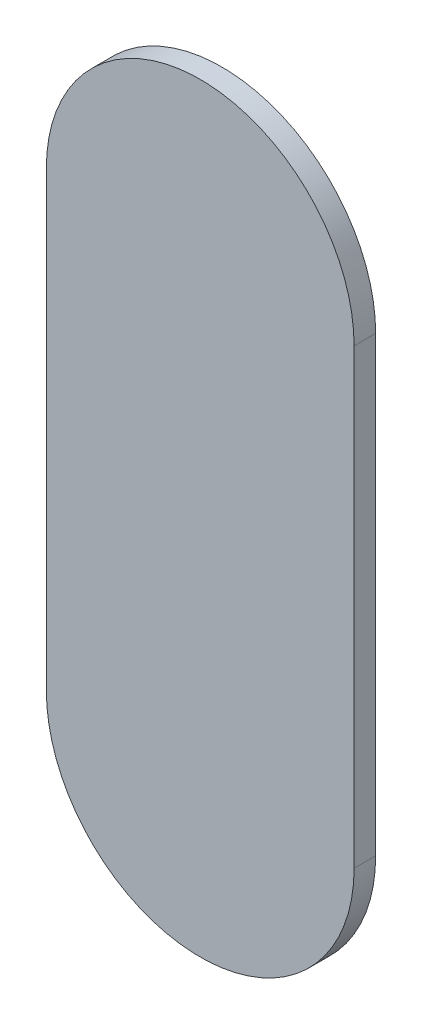
ISO-10303-21;
HEADER;
FILE_DESCRIPTION(('STEP AP214'),'2;1');
FILE_NAME('part.step','',(''),(''),'','','');
FILE_SCHEMA(('AUTOMOTIVE_DESIGN { 1 0 10303 214 1 1 1 1 }'));
ENDSEC;
DATA;
#1=APPLICATION_CONTEXT('core data for automotive mechanical design processes');
#2=APPLICATION_PROTOCOL_DEFINITION('international standard','automotive_design',2000,#1);
#3=PRODUCT_CONTEXT('',#1,'mechanical');
#4=PRODUCT('Part','Part','',(#3));
#5=PRODUCT_RELATED_PRODUCT_CATEGORY('part','',(#4));
#6=PRODUCT_DEFINITION_FORMATION('','',#4);
#7=PRODUCT_DEFINITION_CONTEXT('part definition',#1,'design');
#8=PRODUCT_DEFINITION('design','',#6,#7);
#9=PRODUCT_DEFINITION_SHAPE('','',#8);
#10=(LENGTH_UNIT() NAMED_UNIT(*) SI_UNIT(.MILLI.,.METRE.));
#11=(NAMED_UNIT(*) PLANE_ANGLE_UNIT() SI_UNIT($,.RADIAN.));
#12=(NAMED_UNIT(*) SI_UNIT($,.STERADIAN.) SOLID_ANGLE_UNIT());
#13=UNCERTAINTY_MEASURE_WITH_UNIT(LENGTH_MEASURE(1.E-05),#10,'distance_accuracy_value','');
#14=(GEOMETRIC_REPRESENTATION_CONTEXT(3) GLOBAL_UNCERTAINTY_ASSIGNED_CONTEXT((#13)) GLOBAL_UNIT_ASSIGNED_CONTEXT((#10,
#11,#12)) REPRESENTATION_CONTEXT('',''));
#15=CARTESIAN_POINT('',(0.,0.,0.));
#16=DIRECTION('',(0.,0.,1.));
#17=DIRECTION('',(1.,0.,0.));
#18=AXIS2_PLACEMENT_3D('',#15,#16,#17);
#19=CARTESIAN_POINT('',(95.65,-118.975,1.635));
#20=DIRECTION('',(0.,0.,1.));
#21=DIRECTION('',(1.,0.,0.));
#22=AXIS2_PLACEMENT_3D('',#19,#20,#21);
#23=PLANE('',#22);
#24=DIRECTION('',(0.,-1.,0.));
#25=VECTOR('',#24,1.);
#26=CARTESIAN_POINT('',(95.65,-118.975,1.635));
#27=LINE('',#26,#25);
#28=CARTESIAN_POINT('',(95.65,-118.975,1.635));
#29=VERTEX_POINT('',#28);
#30=CARTESIAN_POINT('',(95.65,-119.71,1.635));
#31=VERTEX_POINT('',#30);
#32=EDGE_CURVE('E68',#29,#31,#27,.T.);
#33=ORIENTED_EDGE('',*,*,#32,.T.);
#34=CARTESIAN_POINT('',(95.9,-119.71,1.635));
#35=DIRECTION('',(0.,0.,1.));
#36=DIRECTION('',(-1.,0.,0.));
#37=AXIS2_PLACEMENT_3D('',#34,#35,#36);
#38=CIRCLE('',#37,0.25);
#39=CARTESIAN_POINT('',(96.15,-119.71,1.635));
#40=VERTEX_POINT('',#39);
#41=EDGE_CURVE('E98',#31,#40,#38,.T.);
#42=ORIENTED_EDGE('',*,*,#41,.T.);
#43=DIRECTION('',(0.,1.,0.));
#44=VECTOR('',#43,1.);
#45=CARTESIAN_POINT('',(96.15,-119.71,1.635));
#46=LINE('',#45,#44);
#47=CARTESIAN_POINT('',(96.15,-118.975,1.635));
#48=VERTEX_POINT('',#47);
#49=EDGE_CURVE('E70',#40,#48,#46,.T.);
#50=ORIENTED_EDGE('',*,*,#49,.T.);
#51=CARTESIAN_POINT('',(95.9,-118.975,1.635));
#52=DIRECTION('',(0.,0.,1.));
#53=DIRECTION('',(1.,0.,0.));
#54=AXIS2_PLACEMENT_3D('',#51,#52,#53);
#55=CIRCLE('',#54,0.25);
#56=EDGE_CURVE('E11',#48,#29,#55,.T.);
#57=ORIENTED_EDGE('',*,*,#56,.T.);
#58=EDGE_LOOP('',(#33,#42,#50,#57));
#59=FACE_BOUND('',#58,.T.);
#60=ADVANCED_FACE('F17',(#59),#23,.T.);
#61=CARTESIAN_POINT('',(95.65,-118.975,1.6));
#62=DIRECTION('',(0.,0.,1.));
#63=DIRECTION('',(1.,0.,0.));
#64=AXIS2_PLACEMENT_3D('',#61,#62,#63);
#65=PLANE('',#64);
#66=CARTESIAN_POINT('',(95.9,-118.975,1.6));
#67=DIRECTION('',(0.,0.,1.));
#68=DIRECTION('',(1.,0.,0.));
#69=AXIS2_PLACEMENT_3D('',#66,#67,#68);
#70=CIRCLE('',#69,0.25);
#71=CARTESIAN_POINT('',(96.15,-118.975,1.6));
#72=VERTEX_POINT('',#71);
#73=CARTESIAN_POINT('',(95.65,-118.975,1.6));
#74=VERTEX_POINT('',#73);
#75=EDGE_CURVE('E21',#72,#74,#70,.T.);
#76=ORIENTED_EDGE('',*,*,#75,.F.);
#77=DIRECTION('',(0.,1.,0.));
#78=VECTOR('',#77,1.);
#79=CARTESIAN_POINT('',(96.15,-119.71,1.6));
#80=LINE('',#79,#78);
#81=CARTESIAN_POINT('',(96.15,-119.71,1.6));
#82=VERTEX_POINT('',#81);
#83=EDGE_CURVE('E101',#82,#72,#80,.T.);
#84=ORIENTED_EDGE('',*,*,#83,.F.);
#85=CARTESIAN_POINT('',(95.9,-119.71,1.6));
#86=DIRECTION('',(0.,0.,1.));
#87=DIRECTION('',(-1.,0.,0.));
#88=AXIS2_PLACEMENT_3D('',#85,#86,#87);
#89=CIRCLE('',#88,0.25);
#90=CARTESIAN_POINT('',(95.65,-119.71,1.6));
#91=VERTEX_POINT('',#90);
#92=EDGE_CURVE('E79',#91,#82,#89,.T.);
#93=ORIENTED_EDGE('',*,*,#92,.F.);
#94=DIRECTION('',(0.,-1.,0.));
#95=VECTOR('',#94,1.);
#96=CARTESIAN_POINT('',(95.65,-118.975,1.6));
#97=LINE('',#96,#95);
#98=EDGE_CURVE('E90',#74,#91,#97,.T.);
#99=ORIENTED_EDGE('',*,*,#98,.F.);
#100=EDGE_LOOP('',(#76,#84,#93,#99));
#101=FACE_BOUND('',#100,.T.);
#102=ADVANCED_FACE('F19',(#101),#65,.F.);
#103=CARTESIAN_POINT('',(95.9,-118.975,1.6));
#104=DIRECTION('',(0.,0.,-1.));
#105=DIRECTION('',(1.,0.,0.));
#106=AXIS2_PLACEMENT_3D('',#103,#104,#105);
#107=CYLINDRICAL_SURFACE('',#106,0.25);
#108=ORIENTED_EDGE('',*,*,#75,.T.);
#109=DIRECTION('',(0.,0.,1.));
#110=VECTOR('',#109,1.);
#111=CARTESIAN_POINT('',(95.65,-118.975,1.6));
#112=LINE('',#111,#110);
#113=EDGE_CURVE('E73',#74,#29,#112,.T.);
#114=ORIENTED_EDGE('',*,*,#113,.T.);
#115=ORIENTED_EDGE('',*,*,#56,.F.);
#116=DIRECTION('',(0.,0.,1.));
#117=VECTOR('',#116,1.);
#118=CARTESIAN_POINT('',(96.15,-118.975,1.6));
#119=LINE('',#118,#117);
#120=EDGE_CURVE('E104',#72,#48,#119,.T.);
#121=ORIENTED_EDGE('',*,*,#120,.F.);
#122=EDGE_LOOP('',(#108,#114,#115,#121));
#123=FACE_BOUND('',#122,.T.);
#124=ADVANCED_FACE('F74',(#123),#107,.T.);
#125=CARTESIAN_POINT('',(96.15,-119.71,1.6));
#126=DIRECTION('',(-1.,0.,0.));
#127=DIRECTION('',(0.,0.,1.));
#128=AXIS2_PLACEMENT_3D('',#125,#126,#127);
#129=PLANE('',#128);
#130=ORIENTED_EDGE('',*,*,#83,.T.);
#131=ORIENTED_EDGE('',*,*,#120,.T.);
#132=ORIENTED_EDGE('',*,*,#49,.F.);
#133=DIRECTION('',(0.,0.,1.));
#134=VECTOR('',#133,1.);
#135=CARTESIAN_POINT('',(96.15,-119.71,1.6));
#136=LINE('',#135,#134);
#137=EDGE_CURVE('E94',#82,#40,#136,.T.);
#138=ORIENTED_EDGE('',*,*,#137,.F.);
#139=EDGE_LOOP('',(#130,#131,#132,#138));
#140=FACE_BOUND('',#139,.T.);
#141=ADVANCED_FACE('F137',(#140),#129,.F.);
#142=CARTESIAN_POINT('',(95.9,-119.71,1.6));
#143=DIRECTION('',(0.,0.,-1.));
#144=DIRECTION('',(-1.,0.,0.));
#145=AXIS2_PLACEMENT_3D('',#142,#143,#144);
#146=CYLINDRICAL_SURFACE('',#145,0.25);
#147=ORIENTED_EDGE('',*,*,#92,.T.);
#148=ORIENTED_EDGE('',*,*,#137,.T.);
#149=ORIENTED_EDGE('',*,*,#41,.F.);
#150=DIRECTION('',(0.,0.,1.));
#151=VECTOR('',#150,1.);
#152=CARTESIAN_POINT('',(95.65,-119.71,1.6));
#153=LINE('',#152,#151);
#154=EDGE_CURVE('E83',#91,#31,#153,.T.);
#155=ORIENTED_EDGE('',*,*,#154,.F.);
#156=EDGE_LOOP('',(#147,#148,#149,#155));
#157=FACE_BOUND('',#156,.T.);
#158=ADVANCED_FACE('F126',(#157),#146,.T.);
#159=CARTESIAN_POINT('',(95.65,-118.975,1.6));
#160=DIRECTION('',(1.,0.,0.));
#161=DIRECTION('',(0.,1.,0.));
#162=AXIS2_PLACEMENT_3D('',#159,#160,#161);
#163=PLANE('',#162);
#164=ORIENTED_EDGE('',*,*,#98,.T.);
#165=ORIENTED_EDGE('',*,*,#154,.T.);
#166=ORIENTED_EDGE('',*,*,#32,.F.);
#167=ORIENTED_EDGE('',*,*,#113,.F.);
#168=EDGE_LOOP('',(#164,#165,#166,#167));
#169=FACE_BOUND('',#168,.T.);
#170=ADVANCED_FACE('F81',(#169),#163,.F.);
#171=CLOSED_SHELL('',(#60,#102,#124,#141,#158,#170));
#172=MANIFOLD_SOLID_BREP('B1',#171);
#173=ADVANCED_BREP_SHAPE_REPRESENTATION('',(#18,#172),#14);
#174=SHAPE_DEFINITION_REPRESENTATION(#9,#173);
ENDSEC;
END-ISO-10303-21;
